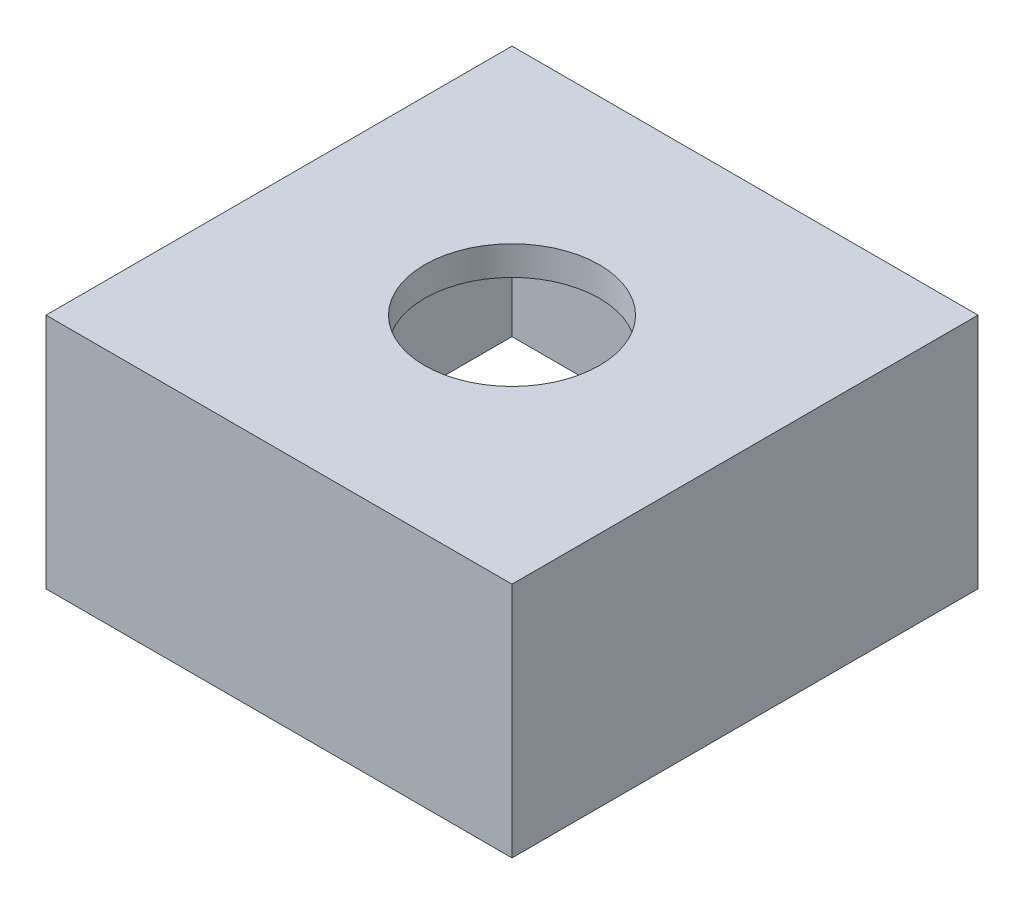
ISO-10303-21;
HEADER;
FILE_DESCRIPTION(('STEP AP214'),'2;1');
FILE_NAME('part.step','',(''),(''),'','','');
FILE_SCHEMA(('AUTOMOTIVE_DESIGN { 1 0 10303 214 1 1 1 1 }'));
ENDSEC;
DATA;
#1=APPLICATION_CONTEXT('core data for automotive mechanical design processes');
#2=APPLICATION_PROTOCOL_DEFINITION('international standard','automotive_design',2000,#1);
#3=PRODUCT_CONTEXT('',#1,'mechanical');
#4=PRODUCT('Part','Part','',(#3));
#5=PRODUCT_RELATED_PRODUCT_CATEGORY('part','',(#4));
#6=PRODUCT_DEFINITION_FORMATION('','',#4);
#7=PRODUCT_DEFINITION_CONTEXT('part definition',#1,'design');
#8=PRODUCT_DEFINITION('design','',#6,#7);
#9=PRODUCT_DEFINITION_SHAPE('','',#8);
#10=(LENGTH_UNIT() NAMED_UNIT(*) SI_UNIT(.MILLI.,.METRE.));
#11=(NAMED_UNIT(*) PLANE_ANGLE_UNIT() SI_UNIT($,.RADIAN.));
#12=(NAMED_UNIT(*) SI_UNIT($,.STERADIAN.) SOLID_ANGLE_UNIT());
#13=UNCERTAINTY_MEASURE_WITH_UNIT(LENGTH_MEASURE(1.E-05),#10,'distance_accuracy_value','');
#14=(GEOMETRIC_REPRESENTATION_CONTEXT(3) GLOBAL_UNCERTAINTY_ASSIGNED_CONTEXT((#13)) GLOBAL_UNIT_ASSIGNED_CONTEXT((#10,
#11,#12)) REPRESENTATION_CONTEXT('',''));
#15=CARTESIAN_POINT('',(0.,0.,0.));
#16=DIRECTION('',(0.,0.,1.));
#17=DIRECTION('',(1.,0.,0.));
#18=AXIS2_PLACEMENT_3D('',#15,#16,#17);
#19=CARTESIAN_POINT('',(0.,0.,0.));
#20=DIRECTION('',(0.,-1.,0.));
#21=DIRECTION('',(0.,0.,-1.));
#22=AXIS2_PLACEMENT_3D('',#19,#20,#21);
#23=PLANE('',#22);
#24=DIRECTION('',(0.,0.,-1.));
#25=VECTOR('',#24,1.);
#26=CARTESIAN_POINT('',(101.6,0.,101.6));
#27=LINE('',#26,#25);
#28=CARTESIAN_POINT('',(101.6,0.,101.6));
#29=VERTEX_POINT('',#28);
#30=CARTESIAN_POINT('',(101.6,0.,-101.6));
#31=VERTEX_POINT('',#30);
#32=EDGE_CURVE('E118',#29,#31,#27,.T.);
#33=ORIENTED_EDGE('',*,*,#32,.F.);
#34=DIRECTION('',(1.,0.,0.));
#35=VECTOR('',#34,1.);
#36=CARTESIAN_POINT('',(-101.6,0.,101.6));
#37=LINE('',#36,#35);
#38=CARTESIAN_POINT('',(-101.6,0.,101.6));
#39=VERTEX_POINT('',#38);
#40=EDGE_CURVE('E69',#39,#29,#37,.T.);
#41=ORIENTED_EDGE('',*,*,#40,.F.);
#42=DIRECTION('',(0.,0.,1.));
#43=VECTOR('',#42,1.);
#44=CARTESIAN_POINT('',(-101.6,0.,101.6));
#45=LINE('',#44,#43);
#46=CARTESIAN_POINT('',(-101.6,0.,-101.6));
#47=VERTEX_POINT('',#46);
#48=EDGE_CURVE('E194',#47,#39,#45,.T.);
#49=ORIENTED_EDGE('',*,*,#48,.F.);
#50=DIRECTION('',(-1.,0.,0.));
#51=VECTOR('',#50,1.);
#52=CARTESIAN_POINT('',(-101.6,0.,-101.6));
#53=LINE('',#52,#51);
#54=EDGE_CURVE('E191',#31,#47,#53,.T.);
#55=ORIENTED_EDGE('',*,*,#54,.F.);
#56=EDGE_LOOP('',(#33,#41,#49,#55));
#57=FACE_BOUND('',#56,.T.);
#58=DIRECTION('',(1.,0.,0.));
#59=VECTOR('',#58,1.);
#60=CARTESIAN_POINT('',(-95.25,0.,95.25));
#61=LINE('',#60,#59);
#62=CARTESIAN_POINT('',(-95.25,0.,95.25));
#63=VERTEX_POINT('',#62);
#64=CARTESIAN_POINT('',(95.25,0.,95.25));
#65=VERTEX_POINT('',#64);
#66=EDGE_CURVE('E152',#63,#65,#61,.T.);
#67=ORIENTED_EDGE('',*,*,#66,.T.);
#68=DIRECTION('',(0.,0.,-1.));
#69=VECTOR('',#68,1.);
#70=CARTESIAN_POINT('',(95.25,0.,95.25));
#71=LINE('',#70,#69);
#72=CARTESIAN_POINT('',(95.25,0.,-95.25));
#73=VERTEX_POINT('',#72);
#74=EDGE_CURVE('E61',#65,#73,#71,.T.);
#75=ORIENTED_EDGE('',*,*,#74,.T.);
#76=DIRECTION('',(-1.,0.,0.));
#77=VECTOR('',#76,1.);
#78=CARTESIAN_POINT('',(-95.25,0.,-95.25));
#79=LINE('',#78,#77);
#80=CARTESIAN_POINT('',(-95.25,0.,-95.25));
#81=VERTEX_POINT('',#80);
#82=EDGE_CURVE('E167',#73,#81,#79,.T.);
#83=ORIENTED_EDGE('',*,*,#82,.T.);
#84=DIRECTION('',(0.,0.,1.));
#85=VECTOR('',#84,1.);
#86=CARTESIAN_POINT('',(-95.25,0.,95.25));
#87=LINE('',#86,#85);
#88=EDGE_CURVE('E171',#81,#63,#87,.T.);
#89=ORIENTED_EDGE('',*,*,#88,.T.);
#90=EDGE_LOOP('',(#67,#75,#83,#89));
#91=FACE_BOUND('',#90,.T.);
#92=ADVANCED_FACE('F45',(#57,#91),#23,.T.);
#93=CARTESIAN_POINT('',(101.6,90.6780000000001,101.6));
#94=DIRECTION('',(-1.,0.,0.));
#95=DIRECTION('',(0.,0.,1.));
#96=AXIS2_PLACEMENT_3D('',#93,#94,#95);
#97=PLANE('',#96);
#98=ORIENTED_EDGE('',*,*,#32,.T.);
#99=DIRECTION('',(0.,-1.,0.));
#100=VECTOR('',#99,1.);
#101=CARTESIAN_POINT('',(101.6,90.6780000000001,-101.6));
#102=LINE('',#101,#100);
#103=CARTESIAN_POINT('',(101.6,103.378,-101.6));
#104=VERTEX_POINT('',#103);
#105=EDGE_CURVE('E11',#104,#31,#102,.T.);
#106=ORIENTED_EDGE('',*,*,#105,.F.);
#107=DIRECTION('',(0.,0.,-1.));
#108=VECTOR('',#107,1.);
#109=CARTESIAN_POINT('',(101.6,103.378,101.6));
#110=LINE('',#109,#108);
#111=CARTESIAN_POINT('',(101.6,103.378,101.6));
#112=VERTEX_POINT('',#111);
#113=EDGE_CURVE('E116',#112,#104,#110,.T.);
#114=ORIENTED_EDGE('',*,*,#113,.F.);
#115=DIRECTION('',(0.,-1.,0.));
#116=VECTOR('',#115,1.);
#117=CARTESIAN_POINT('',(101.6,90.6780000000001,101.6));
#118=LINE('',#117,#116);
#119=EDGE_CURVE('E199',#112,#29,#118,.T.);
#120=ORIENTED_EDGE('',*,*,#119,.T.);
#121=EDGE_LOOP('',(#98,#106,#114,#120));
#122=FACE_BOUND('',#121,.T.);
#123=ADVANCED_FACE('F47',(#122),#97,.F.);
#124=CARTESIAN_POINT('',(-101.6,90.6780000000001,-101.6));
#125=DIRECTION('',(0.,0.,1.));
#126=DIRECTION('',(1.,0.,0.));
#127=AXIS2_PLACEMENT_3D('',#124,#125,#126);
#128=PLANE('',#127);
#129=ORIENTED_EDGE('',*,*,#54,.T.);
#130=DIRECTION('',(0.,-1.,0.));
#131=VECTOR('',#130,1.);
#132=CARTESIAN_POINT('',(-101.6,90.6780000000001,-101.6));
#133=LINE('',#132,#131);
#134=CARTESIAN_POINT('',(-101.6,103.378,-101.6));
#135=VERTEX_POINT('',#134);
#136=EDGE_CURVE('E54',#135,#47,#133,.T.);
#137=ORIENTED_EDGE('',*,*,#136,.F.);
#138=DIRECTION('',(-1.,0.,0.));
#139=VECTOR('',#138,1.);
#140=CARTESIAN_POINT('',(-101.6,103.378,-101.6));
#141=LINE('',#140,#139);
#142=EDGE_CURVE('E121',#104,#135,#141,.T.);
#143=ORIENTED_EDGE('',*,*,#142,.F.);
#144=ORIENTED_EDGE('',*,*,#105,.T.);
#145=EDGE_LOOP('',(#129,#137,#143,#144));
#146=FACE_BOUND('',#145,.T.);
#147=ADVANCED_FACE('F122',(#146),#128,.F.);
#148=CARTESIAN_POINT('',(-101.6,90.6780000000001,101.6));
#149=DIRECTION('',(1.,0.,0.));
#150=DIRECTION('',(0.,0.,-1.));
#151=AXIS2_PLACEMENT_3D('',#148,#149,#150);
#152=PLANE('',#151);
#153=ORIENTED_EDGE('',*,*,#48,.T.);
#154=DIRECTION('',(0.,-1.,0.));
#155=VECTOR('',#154,1.);
#156=CARTESIAN_POINT('',(-101.6,90.6780000000001,101.6));
#157=LINE('',#156,#155);
#158=CARTESIAN_POINT('',(-101.6,103.378,101.6));
#159=VERTEX_POINT('',#158);
#160=EDGE_CURVE('E202',#159,#39,#157,.T.);
#161=ORIENTED_EDGE('',*,*,#160,.F.);
#162=DIRECTION('',(0.,0.,1.));
#163=VECTOR('',#162,1.);
#164=CARTESIAN_POINT('',(-101.6,103.378,101.6));
#165=LINE('',#164,#163);
#166=EDGE_CURVE('E128',#135,#159,#165,.T.);
#167=ORIENTED_EDGE('',*,*,#166,.F.);
#168=ORIENTED_EDGE('',*,*,#136,.T.);
#169=EDGE_LOOP('',(#153,#161,#167,#168));
#170=FACE_BOUND('',#169,.T.);
#171=ADVANCED_FACE('F207',(#170),#152,.F.);
#172=CARTESIAN_POINT('',(-101.6,90.6780000000001,101.6));
#173=DIRECTION('',(0.,0.,-1.));
#174=DIRECTION('',(-1.,0.,0.));
#175=AXIS2_PLACEMENT_3D('',#172,#173,#174);
#176=PLANE('',#175);
#177=ORIENTED_EDGE('',*,*,#40,.T.);
#178=ORIENTED_EDGE('',*,*,#119,.F.);
#179=DIRECTION('',(1.,0.,0.));
#180=VECTOR('',#179,1.);
#181=CARTESIAN_POINT('',(-101.6,103.378,101.6));
#182=LINE('',#181,#180);
#183=EDGE_CURVE('E133',#159,#112,#182,.T.);
#184=ORIENTED_EDGE('',*,*,#183,.F.);
#185=ORIENTED_EDGE('',*,*,#160,.T.);
#186=EDGE_LOOP('',(#177,#178,#184,#185));
#187=FACE_BOUND('',#186,.T.);
#188=ADVANCED_FACE('F245',(#187),#176,.F.);
#189=CARTESIAN_POINT('',(95.25,90.6780000000001,95.25));
#190=DIRECTION('',(-1.,0.,0.));
#191=DIRECTION('',(0.,0.,1.));
#192=AXIS2_PLACEMENT_3D('',#189,#190,#191);
#193=PLANE('',#192);
#194=ORIENTED_EDGE('',*,*,#74,.F.);
#195=DIRECTION('',(0.,-1.,0.));
#196=VECTOR('',#195,1.);
#197=CARTESIAN_POINT('',(95.25,90.6780000000001,95.25));
#198=LINE('',#197,#196);
#199=CARTESIAN_POINT('',(95.25,90.6780000000001,95.25));
#200=VERTEX_POINT('',#199);
#201=EDGE_CURVE('E164',#200,#65,#198,.T.);
#202=ORIENTED_EDGE('',*,*,#201,.F.);
#203=DIRECTION('',(0.,0.,-1.));
#204=VECTOR('',#203,1.);
#205=CARTESIAN_POINT('',(95.25,90.6780000000001,95.25));
#206=LINE('',#205,#204);
#207=CARTESIAN_POINT('',(95.25,90.6780000000001,-95.25));
#208=VERTEX_POINT('',#207);
#209=EDGE_CURVE('E147',#200,#208,#206,.T.);
#210=ORIENTED_EDGE('',*,*,#209,.T.);
#211=DIRECTION('',(0.,-1.,0.));
#212=VECTOR('',#211,1.);
#213=CARTESIAN_POINT('',(95.25,90.6780000000001,-95.25));
#214=LINE('',#213,#212);
#215=EDGE_CURVE('E186',#208,#73,#214,.T.);
#216=ORIENTED_EDGE('',*,*,#215,.T.);
#217=EDGE_LOOP('',(#194,#202,#210,#216));
#218=FACE_BOUND('',#217,.T.);
#219=ADVANCED_FACE('F217',(#218),#193,.T.);
#220=CARTESIAN_POINT('',(-95.25,90.6780000000001,-95.25));
#221=DIRECTION('',(0.,0.,1.));
#222=DIRECTION('',(1.,0.,0.));
#223=AXIS2_PLACEMENT_3D('',#220,#221,#222);
#224=PLANE('',#223);
#225=ORIENTED_EDGE('',*,*,#82,.F.);
#226=ORIENTED_EDGE('',*,*,#215,.F.);
#227=DIRECTION('',(-1.,0.,0.));
#228=VECTOR('',#227,1.);
#229=CARTESIAN_POINT('',(-95.25,90.6780000000001,-95.25));
#230=LINE('',#229,#228);
#231=CARTESIAN_POINT('',(-95.25,90.6780000000001,-95.25));
#232=VERTEX_POINT('',#231);
#233=EDGE_CURVE('E151',#208,#232,#230,.T.);
#234=ORIENTED_EDGE('',*,*,#233,.T.);
#235=DIRECTION('',(0.,-1.,0.));
#236=VECTOR('',#235,1.);
#237=CARTESIAN_POINT('',(-95.25,90.6780000000001,-95.25));
#238=LINE('',#237,#236);
#239=EDGE_CURVE('E183',#232,#81,#238,.T.);
#240=ORIENTED_EDGE('',*,*,#239,.T.);
#241=EDGE_LOOP('',(#225,#226,#234,#240));
#242=FACE_BOUND('',#241,.T.);
#243=ADVANCED_FACE('F221',(#242),#224,.T.);
#244=CARTESIAN_POINT('',(-95.25,90.6780000000001,95.25));
#245=DIRECTION('',(1.,0.,0.));
#246=DIRECTION('',(0.,0.,-1.));
#247=AXIS2_PLACEMENT_3D('',#244,#245,#246);
#248=PLANE('',#247);
#249=ORIENTED_EDGE('',*,*,#88,.F.);
#250=ORIENTED_EDGE('',*,*,#239,.F.);
#251=DIRECTION('',(0.,0.,1.));
#252=VECTOR('',#251,1.);
#253=CARTESIAN_POINT('',(-95.25,90.6780000000001,95.25));
#254=LINE('',#253,#252);
#255=CARTESIAN_POINT('',(-95.25,90.6780000000001,95.25));
#256=VERTEX_POINT('',#255);
#257=EDGE_CURVE('E156',#232,#256,#254,.T.);
#258=ORIENTED_EDGE('',*,*,#257,.T.);
#259=DIRECTION('',(0.,-1.,0.));
#260=VECTOR('',#259,1.);
#261=CARTESIAN_POINT('',(-95.25,90.6780000000001,95.25));
#262=LINE('',#261,#260);
#263=EDGE_CURVE('E180',#256,#63,#262,.T.);
#264=ORIENTED_EDGE('',*,*,#263,.T.);
#265=EDGE_LOOP('',(#249,#250,#258,#264));
#266=FACE_BOUND('',#265,.T.);
#267=ADVANCED_FACE('F224',(#266),#248,.T.);
#268=CARTESIAN_POINT('',(-95.25,90.6780000000001,95.25));
#269=DIRECTION('',(0.,0.,-1.));
#270=DIRECTION('',(-1.,0.,0.));
#271=AXIS2_PLACEMENT_3D('',#268,#269,#270);
#272=PLANE('',#271);
#273=ORIENTED_EDGE('',*,*,#66,.F.);
#274=ORIENTED_EDGE('',*,*,#263,.F.);
#275=DIRECTION('',(1.,0.,0.));
#276=VECTOR('',#275,1.);
#277=CARTESIAN_POINT('',(-95.25,90.6780000000001,95.25));
#278=LINE('',#277,#276);
#279=EDGE_CURVE('E160',#256,#200,#278,.T.);
#280=ORIENTED_EDGE('',*,*,#279,.T.);
#281=ORIENTED_EDGE('',*,*,#201,.T.);
#282=EDGE_LOOP('',(#273,#274,#280,#281));
#283=FACE_BOUND('',#282,.T.);
#284=ADVANCED_FACE('F216',(#283),#272,.T.);
#285=CARTESIAN_POINT('',(0.,90.6780000000001,0.));
#286=DIRECTION('',(0.,-1.,0.));
#287=DIRECTION('',(0.,0.,-1.));
#288=AXIS2_PLACEMENT_3D('',#285,#286,#287);
#289=PLANE('',#288);
#290=CARTESIAN_POINT('',(0.,90.6780000000001,0.));
#291=DIRECTION('',(0.,-1.,0.));
#292=DIRECTION('',(0.,0.,-1.));
#293=AXIS2_PLACEMENT_3D('',#290,#291,#292);
#294=CIRCLE('',#293,38.1);
#295=CARTESIAN_POINT('',(0.,90.6780000000001,38.1));
#296=VERTEX_POINT('',#295);
#297=EDGE_CURVE('E135',#296,#296,#294,.T.);
#298=ORIENTED_EDGE('',*,*,#297,.F.);
#299=EDGE_LOOP('',(#298));
#300=FACE_BOUND('',#299,.T.);
#301=ORIENTED_EDGE('',*,*,#209,.F.);
#302=ORIENTED_EDGE('',*,*,#279,.F.);
#303=ORIENTED_EDGE('',*,*,#257,.F.);
#304=ORIENTED_EDGE('',*,*,#233,.F.);
#305=EDGE_LOOP('',(#301,#302,#303,#304));
#306=FACE_BOUND('',#305,.T.);
#307=ADVANCED_FACE('F225',(#300,#306),#289,.T.);
#308=CARTESIAN_POINT('',(0.,103.378,0.));
#309=DIRECTION('',(0.,-1.,0.));
#310=DIRECTION('',(0.,0.,-1.));
#311=AXIS2_PLACEMENT_3D('',#308,#309,#310);
#312=PLANE('',#311);
#313=CARTESIAN_POINT('',(0.,103.378,0.));
#314=DIRECTION('',(0.,1.,0.));
#315=DIRECTION('',(0.,0.,1.));
#316=AXIS2_PLACEMENT_3D('',#313,#314,#315);
#317=CIRCLE('',#316,38.1);
#318=CARTESIAN_POINT('',(0.,103.378,38.1));
#319=VERTEX_POINT('',#318);
#320=EDGE_CURVE('E139',#319,#319,#317,.T.);
#321=ORIENTED_EDGE('',*,*,#320,.F.);
#322=EDGE_LOOP('',(#321));
#323=FACE_BOUND('',#322,.T.);
#324=ORIENTED_EDGE('',*,*,#113,.T.);
#325=ORIENTED_EDGE('',*,*,#142,.T.);
#326=ORIENTED_EDGE('',*,*,#166,.T.);
#327=ORIENTED_EDGE('',*,*,#183,.T.);
#328=EDGE_LOOP('',(#324,#325,#326,#327));
#329=FACE_BOUND('',#328,.T.);
#330=ADVANCED_FACE('F131',(#323,#329),#312,.F.);
#331=CARTESIAN_POINT('',(0.,0.,0.));
#332=DIRECTION('',(0.,1.,0.));
#333=DIRECTION('',(0.,0.,1.));
#334=AXIS2_PLACEMENT_3D('',#331,#332,#333);
#335=CYLINDRICAL_SURFACE('',#334,38.1);
#336=CARTESIAN_POINT('',(0.,90.6780000000001,38.1));
#337=CARTESIAN_POINT('',(0.,90.8102916666668,38.1));
#338=CARTESIAN_POINT('',(0.,90.9425833333335,38.1));
#339=CARTESIAN_POINT('',(0.,91.2071666666668,38.1));
#340=CARTESIAN_POINT('',(0.,91.3394583333335,38.1));
#341=CARTESIAN_POINT('',(0.,91.6040416666668,38.1));
#342=CARTESIAN_POINT('',(0.,91.7363333333335,38.1));
#343=CARTESIAN_POINT('',(0.,92.0009166666668,38.1));
#344=CARTESIAN_POINT('',(0.,92.1332083333335,38.1));
#345=CARTESIAN_POINT('',(0.,92.3977916666668,38.1));
#346=CARTESIAN_POINT('',(0.,92.5300833333335,38.1));
#347=CARTESIAN_POINT('',(0.,92.7946666666668,38.1));
#348=CARTESIAN_POINT('',(0.,92.9269583333335,38.1));
#349=CARTESIAN_POINT('',(0.,93.1915416666668,38.1));
#350=CARTESIAN_POINT('',(0.,93.3238333333335,38.1));
#351=CARTESIAN_POINT('',(0.,93.5884166666668,38.1));
#352=CARTESIAN_POINT('',(0.,93.7207083333335,38.1));
#353=CARTESIAN_POINT('',(0.,93.9852916666668,38.1));
#354=CARTESIAN_POINT('',(0.,94.1175833333335,38.1));
#355=CARTESIAN_POINT('',(0.,94.3821666666668,38.1));
#356=CARTESIAN_POINT('',(0.,94.5144583333335,38.1));
#357=CARTESIAN_POINT('',(0.,94.7790416666668,38.1));
#358=CARTESIAN_POINT('',(0.,94.9113333333335,38.1));
#359=CARTESIAN_POINT('',(0.,95.1759166666668,38.1));
#360=CARTESIAN_POINT('',(0.,95.3082083333335,38.1));
#361=CARTESIAN_POINT('',(0.,95.5727916666668,38.1));
#362=CARTESIAN_POINT('',(0.,95.7050833333335,38.1));
#363=CARTESIAN_POINT('',(0.,95.9696666666668,38.1));
#364=CARTESIAN_POINT('',(0.,96.1019583333335,38.1));
#365=CARTESIAN_POINT('',(0.,96.3665416666668,38.1));
#366=CARTESIAN_POINT('',(0.,96.4988333333335,38.1));
#367=CARTESIAN_POINT('',(0.,96.7634166666668,38.1));
#368=CARTESIAN_POINT('',(0.,96.8957083333335,38.1));
#369=CARTESIAN_POINT('',(0.,97.1602916666668,38.1));
#370=CARTESIAN_POINT('',(0.,97.2925833333335,38.1));
#371=CARTESIAN_POINT('',(0.,97.5571666666668,38.1));
#372=CARTESIAN_POINT('',(0.,97.6894583333335,38.1));
#373=CARTESIAN_POINT('',(0.,97.9540416666668,38.1));
#374=CARTESIAN_POINT('',(0.,98.0863333333335,38.1));
#375=CARTESIAN_POINT('',(0.,98.3509166666668,38.1));
#376=CARTESIAN_POINT('',(0.,98.4832083333335,38.1));
#377=CARTESIAN_POINT('',(0.,98.7477916666668,38.1));
#378=CARTESIAN_POINT('',(0.,98.8800833333334,38.1));
#379=CARTESIAN_POINT('',(0.,99.1446666666668,38.1));
#380=CARTESIAN_POINT('',(0.,99.2769583333335,38.1));
#381=CARTESIAN_POINT('',(0.,99.5415416666668,38.1));
#382=CARTESIAN_POINT('',(0.,99.6738333333335,38.1));
#383=CARTESIAN_POINT('',(0.,99.9384166666668,38.1));
#384=CARTESIAN_POINT('',(0.,100.070708333333,38.1));
#385=CARTESIAN_POINT('',(0.,100.335291666667,38.1));
#386=CARTESIAN_POINT('',(0.,100.467583333333,38.1));
#387=CARTESIAN_POINT('',(0.,100.732166666667,38.1));
#388=CARTESIAN_POINT('',(0.,100.864458333333,38.1));
#389=CARTESIAN_POINT('',(0.,101.129041666667,38.1));
#390=CARTESIAN_POINT('',(0.,101.261333333333,38.1));
#391=CARTESIAN_POINT('',(0.,101.525916666667,38.1));
#392=CARTESIAN_POINT('',(0.,101.658208333333,38.1));
#393=CARTESIAN_POINT('',(0.,101.922791666667,38.1));
#394=CARTESIAN_POINT('',(0.,102.055083333333,38.1));
#395=CARTESIAN_POINT('',(0.,102.319666666667,38.1));
#396=CARTESIAN_POINT('',(0.,102.451958333333,38.1));
#397=CARTESIAN_POINT('',(0.,102.716541666667,38.1));
#398=CARTESIAN_POINT('',(0.,102.848833333333,38.1));
#399=CARTESIAN_POINT('',(0.,103.113416666667,38.1));
#400=CARTESIAN_POINT('',(0.,103.245708333333,38.1));
#401=CARTESIAN_POINT('',(0.,103.378,38.1));
#402=B_SPLINE_CURVE_WITH_KNOTS('',3,(#336,#337,#338,#339,#340,#341,#342,#343,#344,#345,#346,
#347,#348,#349,#350,#351,#352,#353,#354,#355,#356,#357,#358,#359,#360,#361,#362,#363,#364,#365,
#366,#367,#368,#369,#370,#371,#372,#373,#374,#375,#376,#377,#378,#379,#380,#381,#382,#383,#384,
#385,#386,#387,#388,#389,#390,#391,#392,#393,#394,#395,#396,#397,#398,#399,#400,#401),
.UNSPECIFIED.,.F.,.F.,(4,2,2,2,2,2,2,2,2,2,2,2,2,2,2,2,2,2,2,2,2,2,2,2,2,2,2,2,2,2,2,2,4),(0.,
0.396875000000005,0.793749999999996,1.190625,1.58749999999999,1.984375,2.38125,2.77812499999999,
3.175,3.571875,3.96874999999999,4.365625,4.7625,5.15937499999999,5.55625,5.95312499999999,
6.34999999999999,6.746875,7.14374999999999,7.540625,7.93749999999999,8.33437499999999,8.73125,
9.12812499999999,9.52499999999999,9.921875,10.31875,10.715625,11.1125,11.509375,11.90625,
12.303125,12.7),.UNSPECIFIED.);
#403=EDGE_CURVE('BSEAM233',#296,#319,#402,.T.);
#404=ORIENTED_EDGE('',*,*,#297,.T.);
#405=ORIENTED_EDGE('',*,*,#320,.T.);
#406=ORIENTED_EDGE('',*,*,#403,.T.);
#407=ORIENTED_EDGE('',*,*,#403,.F.);
#408=EDGE_LOOP('',(#404,#406,#405,#407));
#409=FACE_BOUND('',#408,.T.);
#410=ADVANCED_FACE('F233',(#409),#335,.F.);
#411=CLOSED_SHELL('',(#92,#123,#147,#171,#188,#219,#243,#267,#284,#307,#330,#410));
#412=MANIFOLD_SOLID_BREP('B2',#411);
#413=ADVANCED_BREP_SHAPE_REPRESENTATION('',(#18,#412),#14);
#414=SHAPE_DEFINITION_REPRESENTATION(#9,#413);
ENDSEC;
END-ISO-10303-21;
